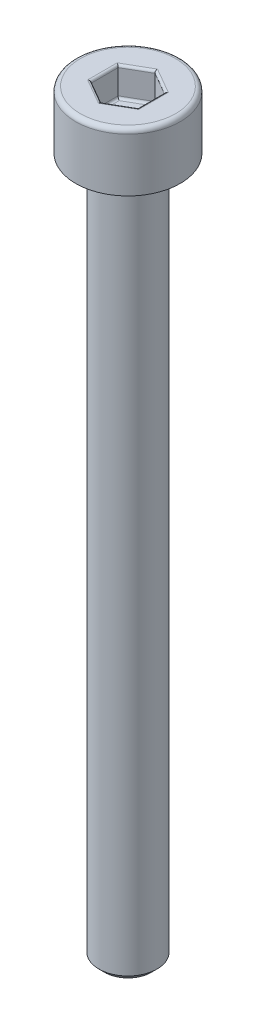
ISO-10303-21;
HEADER;
FILE_DESCRIPTION(('STEP AP214'),'2;1');
FILE_NAME('part.step','',(''),(''),'','','');
FILE_SCHEMA(('AUTOMOTIVE_DESIGN { 1 0 10303 214 1 1 1 1 }'));
ENDSEC;
DATA;
#1=APPLICATION_CONTEXT('core data for automotive mechanical design processes');
#2=APPLICATION_PROTOCOL_DEFINITION('international standard','automotive_design',2000,#1);
#3=PRODUCT_CONTEXT('',#1,'mechanical');
#4=PRODUCT('Part','Part','',(#3));
#5=PRODUCT_RELATED_PRODUCT_CATEGORY('part','',(#4));
#6=PRODUCT_DEFINITION_FORMATION('','',#4);
#7=PRODUCT_DEFINITION_CONTEXT('part definition',#1,'design');
#8=PRODUCT_DEFINITION('design','',#6,#7);
#9=PRODUCT_DEFINITION_SHAPE('','',#8);
#10=(LENGTH_UNIT() NAMED_UNIT(*) SI_UNIT(.MILLI.,.METRE.));
#11=(NAMED_UNIT(*) PLANE_ANGLE_UNIT() SI_UNIT($,.RADIAN.));
#12=(NAMED_UNIT(*) SI_UNIT($,.STERADIAN.) SOLID_ANGLE_UNIT());
#13=UNCERTAINTY_MEASURE_WITH_UNIT(LENGTH_MEASURE(1.E-05),#10,'distance_accuracy_value','');
#14=(GEOMETRIC_REPRESENTATION_CONTEXT(3) GLOBAL_UNCERTAINTY_ASSIGNED_CONTEXT((#13)) GLOBAL_UNIT_ASSIGNED_CONTEXT((#10,
#11,#12)) REPRESENTATION_CONTEXT('',''));
#15=CARTESIAN_POINT('',(0.,0.,0.));
#16=DIRECTION('',(0.,0.,1.));
#17=DIRECTION('',(1.,0.,0.));
#18=AXIS2_PLACEMENT_3D('',#15,#16,#17);
#19=CARTESIAN_POINT('',(0.,-32.5,0.));
#20=DIRECTION('',(0.,-1.,0.));
#21=DIRECTION('',(0.,0.,-1.));
#22=AXIS2_PLACEMENT_3D('',#19,#20,#21);
#23=PLANE('',#22);
#24=CARTESIAN_POINT('',(0.,-32.5,0.));
#25=DIRECTION('',(0.,-1.,0.));
#26=DIRECTION('',(0.,0.,-1.));
#27=AXIS2_PLACEMENT_3D('',#24,#25,#26);
#28=CIRCLE('',#27,0.999999999999997);
#29=CARTESIAN_POINT('',(0.,-32.5,-0.999999999999997));
#30=VERTEX_POINT('',#29);
#31=EDGE_CURVE('E261',#30,#30,#28,.T.);
#32=ORIENTED_EDGE('',*,*,#31,.T.);
#33=EDGE_LOOP('',(#32));
#34=FACE_BOUND('',#33,.T.);
#35=ADVANCED_FACE('F33',(#34),#23,.T.);
#36=CARTESIAN_POINT('',(0.,0.,0.));
#37=DIRECTION('',(0.,1.,0.));
#38=DIRECTION('',(0.,0.,1.));
#39=AXIS2_PLACEMENT_3D('',#36,#37,#38);
#40=CYLINDRICAL_SURFACE('',#39,1.25);
#41=CARTESIAN_POINT('',(0.,-2.74999999999999,0.));
#42=DIRECTION('',(0.,-1.,0.));
#43=DIRECTION('',(0.,0.,-1.));
#44=AXIS2_PLACEMENT_3D('',#41,#42,#43);
#45=CIRCLE('',#44,1.25);
#46=CARTESIAN_POINT('',(0.,-2.74999999999999,-1.25));
#47=VERTEX_POINT('',#46);
#48=EDGE_CURVE('E258',#47,#47,#45,.T.);
#49=ORIENTED_EDGE('',*,*,#48,.T.);
#50=EDGE_LOOP('',(#49));
#51=FACE_BOUND('',#50,.T.);
#52=CARTESIAN_POINT('',(0.,-32.25,0.));
#53=DIRECTION('',(0.,-1.,0.));
#54=DIRECTION('',(0.,0.,-1.));
#55=AXIS2_PLACEMENT_3D('',#52,#53,#54);
#56=CIRCLE('',#55,1.25);
#57=CARTESIAN_POINT('',(0.,-32.25,-1.25));
#58=VERTEX_POINT('',#57);
#59=EDGE_CURVE('E255',#58,#58,#56,.F.);
#60=ORIENTED_EDGE('',*,*,#59,.T.);
#61=EDGE_LOOP('',(#60));
#62=FACE_BOUND('',#61,.T.);
#63=ADVANCED_FACE('F287',(#51,#62),#40,.T.);
#64=CARTESIAN_POINT('',(-1.25,-2.5,0.));
#65=DIRECTION('',(0.,-1.,0.));
#66=DIRECTION('',(0.,0.,-1.));
#67=AXIS2_PLACEMENT_3D('',#64,#65,#66);
#68=PLANE('',#67);
#69=CARTESIAN_POINT('',(0.,-2.5,0.));
#70=DIRECTION('',(0.,-1.,0.));
#71=DIRECTION('',(0.,0.,-1.));
#72=AXIS2_PLACEMENT_3D('',#69,#70,#71);
#73=CIRCLE('',#72,1.49999999999999);
#74=CARTESIAN_POINT('',(0.,-2.5,-1.49999999999999));
#75=VERTEX_POINT('',#74);
#76=EDGE_CURVE('E252',#75,#75,#73,.F.);
#77=ORIENTED_EDGE('',*,*,#76,.T.);
#78=EDGE_LOOP('',(#77));
#79=FACE_BOUND('',#78,.T.);
#80=CARTESIAN_POINT('',(0.,-2.5,0.));
#81=DIRECTION('',(0.,1.,0.));
#82=DIRECTION('',(0.,0.,1.));
#83=AXIS2_PLACEMENT_3D('',#80,#81,#82);
#84=CIRCLE('',#83,2.25);
#85=CARTESIAN_POINT('',(0.,-2.5,2.25));
#86=VERTEX_POINT('',#85);
#87=EDGE_CURVE('E249',#86,#86,#84,.T.);
#88=ORIENTED_EDGE('',*,*,#87,.F.);
#89=EDGE_LOOP('',(#88));
#90=FACE_BOUND('',#89,.T.);
#91=ADVANCED_FACE('F293',(#79,#90),#68,.T.);
#92=CARTESIAN_POINT('',(0.,0.,0.));
#93=DIRECTION('',(0.,1.,0.));
#94=DIRECTION('',(0.,0.,1.));
#95=AXIS2_PLACEMENT_3D('',#92,#93,#94);
#96=CYLINDRICAL_SURFACE('',#95,2.25);
#97=CARTESIAN_POINT('',(0.,-0.2,0.));
#98=DIRECTION('',(0.,1.,0.));
#99=DIRECTION('',(0.,0.,1.));
#100=AXIS2_PLACEMENT_3D('',#97,#98,#99);
#101=CIRCLE('',#100,2.25);
#102=CARTESIAN_POINT('',(0.,-0.2,2.25));
#103=VERTEX_POINT('',#102);
#104=EDGE_CURVE('E159',#103,#103,#101,.F.);
#105=ORIENTED_EDGE('',*,*,#104,.T.);
#106=EDGE_LOOP('',(#105));
#107=FACE_BOUND('',#106,.T.);
#108=ORIENTED_EDGE('',*,*,#87,.T.);
#109=EDGE_LOOP('',(#108));
#110=FACE_BOUND('',#109,.T.);
#111=ADVANCED_FACE('F303',(#107,#110),#96,.T.);
#112=CARTESIAN_POINT('',(-2.25,0.,0.));
#113=DIRECTION('',(0.,1.,0.));
#114=DIRECTION('',(0.,0.,1.));
#115=AXIS2_PLACEMENT_3D('',#112,#113,#114);
#116=PLANE('',#115);
#117=DIRECTION('',(0.,0.,1.));
#118=VECTOR('',#117,1.);
#119=CARTESIAN_POINT('',(-1.1,0.,-0.577350269189627));
#120=LINE('',#119,#118);
#121=CARTESIAN_POINT('',(-1.1,0.,0.635085296108588));
#122=VERTEX_POINT('',#121);
#123=CARTESIAN_POINT('',(-1.1,0.,-0.635085296108589));
#124=VERTEX_POINT('',#123);
#125=EDGE_CURVE('E175',#122,#124,#120,.F.);
#126=ORIENTED_EDGE('',*,*,#125,.T.);
#127=DIRECTION('',(-0.866025403784439,0.,0.5));
#128=VECTOR('',#127,1.);
#129=CARTESIAN_POINT('',(-0.0500000000000009,0.,-1.2413030787577));
#130=LINE('',#129,#128);
#131=CARTESIAN_POINT('',(0.,0.,-1.27017059221718));
#132=VERTEX_POINT('',#131);
#133=EDGE_CURVE('E134',#124,#132,#130,.F.);
#134=ORIENTED_EDGE('',*,*,#133,.T.);
#135=DIRECTION('',(-0.866025403784439,0.,-0.5));
#136=VECTOR('',#135,1.);
#137=CARTESIAN_POINT('',(1.05,0.,-0.663952809568071));
#138=LINE('',#137,#136);
#139=CARTESIAN_POINT('',(1.1,0.,-0.63508529610859));
#140=VERTEX_POINT('',#139);
#141=EDGE_CURVE('E161',#132,#140,#138,.F.);
#142=ORIENTED_EDGE('',*,*,#141,.T.);
#143=DIRECTION('',(0.,0.,-1.));
#144=VECTOR('',#143,1.);
#145=CARTESIAN_POINT('',(1.1,0.,0.577350269189625));
#146=LINE('',#145,#144);
#147=CARTESIAN_POINT('',(1.1,0.,0.635085296108588));
#148=VERTEX_POINT('',#147);
#149=EDGE_CURVE('E169',#140,#148,#146,.F.);
#150=ORIENTED_EDGE('',*,*,#149,.T.);
#151=DIRECTION('',(0.866025403784439,0.,-0.5));
#152=VECTOR('',#151,1.);
#153=CARTESIAN_POINT('',(0.0499999999999991,0.,1.24130307875769));
#154=LINE('',#153,#152);
#155=CARTESIAN_POINT('',(0.,0.,1.27017059221718));
#156=VERTEX_POINT('',#155);
#157=EDGE_CURVE('E171',#148,#156,#154,.F.);
#158=ORIENTED_EDGE('',*,*,#157,.T.);
#159=DIRECTION('',(0.866025403784439,0.,0.5));
#160=VECTOR('',#159,1.);
#161=CARTESIAN_POINT('',(-1.05,0.,0.663952809568069));
#162=LINE('',#161,#160);
#163=EDGE_CURVE('E173',#156,#122,#162,.F.);
#164=ORIENTED_EDGE('',*,*,#163,.T.);
#165=EDGE_LOOP('',(#126,#134,#142,#150,#158,#164));
#166=FACE_BOUND('',#165,.T.);
#167=CARTESIAN_POINT('',(0.,0.,0.));
#168=DIRECTION('',(0.,1.,0.));
#169=DIRECTION('',(0.,0.,1.));
#170=AXIS2_PLACEMENT_3D('',#167,#168,#169);
#171=CIRCLE('',#170,2.05);
#172=CARTESIAN_POINT('',(0.,0.,2.05));
#173=VERTEX_POINT('',#172);
#174=EDGE_CURVE('E164',#173,#173,#171,.T.);
#175=ORIENTED_EDGE('',*,*,#174,.T.);
#176=EDGE_LOOP('',(#175));
#177=FACE_BOUND('',#176,.T.);
#178=ADVANCED_FACE('F266',(#166,#177),#116,.T.);
#179=CARTESIAN_POINT('',(0.,-2.5,0.));
#180=DIRECTION('',(0.,1.,0.));
#181=DIRECTION('',(0.,0.,1.));
#182=AXIS2_PLACEMENT_3D('',#179,#180,#181);
#183=CONICAL_SURFACE('',#182,1.49999999999999,0.78539816339745);
#184=ORIENTED_EDGE('',*,*,#48,.F.);
#185=EDGE_LOOP('',(#184));
#186=FACE_BOUND('',#185,.T.);
#187=ORIENTED_EDGE('',*,*,#76,.F.);
#188=EDGE_LOOP('',(#187));
#189=FACE_BOUND('',#188,.T.);
#190=ADVANCED_FACE('F281',(#186,#189),#183,.T.);
#191=CARTESIAN_POINT('',(0.,-32.25,0.));
#192=DIRECTION('',(0.,1.,0.));
#193=DIRECTION('',(0.,0.,1.));
#194=AXIS2_PLACEMENT_3D('',#191,#192,#193);
#195=CONICAL_SURFACE('',#194,1.25,0.785398163397446);
#196=ORIENTED_EDGE('',*,*,#31,.F.);
#197=EDGE_LOOP('',(#196));
#198=FACE_BOUND('',#197,.T.);
#199=ORIENTED_EDGE('',*,*,#59,.F.);
#200=EDGE_LOOP('',(#199));
#201=FACE_BOUND('',#200,.T.);
#202=ADVANCED_FACE('F271',(#198,#201),#195,.T.);
#203=CARTESIAN_POINT('',(0.,-0.2,0.));
#204=DIRECTION('',(0.,1.,0.));
#205=DIRECTION('',(0.,0.,1.));
#206=AXIS2_PLACEMENT_3D('',#203,#204,#205);
#207=TOROIDAL_SURFACE('',#206,2.05,0.2);
#208=ORIENTED_EDGE('',*,*,#104,.F.);
#209=EDGE_LOOP('',(#208));
#210=FACE_BOUND('',#209,.T.);
#211=ORIENTED_EDGE('',*,*,#174,.F.);
#212=EDGE_LOOP('',(#211));
#213=FACE_BOUND('',#212,.T.);
#214=ADVANCED_FACE('F268',(#210,#213),#207,.T.);
#215=CARTESIAN_POINT('',(0.999999999999998,-1.25,-0.577350269189627));
#216=DIRECTION('',(0.5,0.,-0.866025403784439));
#217=DIRECTION('',(-0.866025403784439,0.,-0.5));
#218=AXIS2_PLACEMENT_3D('',#215,#216,#217);
#219=PLANE('',#218);
#220=DIRECTION('',(0.,1.,0.));
#221=VECTOR('',#220,1.);
#222=CARTESIAN_POINT('',(0.999999999999998,-1.25,-0.577350269189627));
#223=LINE('',#222,#221);
#224=CARTESIAN_POINT('',(0.999999999999998,-1.15,-0.577350269189627));
#225=VERTEX_POINT('',#224);
#226=CARTESIAN_POINT('',(0.999999999999998,-0.1,-0.577350269189627));
#227=VERTEX_POINT('',#226);
#228=EDGE_CURVE('E243',#225,#227,#223,.T.);
#229=ORIENTED_EDGE('',*,*,#228,.T.);
#230=DIRECTION('',(-0.866025403784439,0.,-0.5));
#231=VECTOR('',#230,1.);
#232=CARTESIAN_POINT('',(0.,-0.1,-1.15470053837925));
#233=LINE('',#232,#231);
#234=CARTESIAN_POINT('',(0.,-0.1,-1.15470053837925));
#235=VERTEX_POINT('',#234);
#236=EDGE_CURVE('E195',#227,#235,#233,.T.);
#237=ORIENTED_EDGE('',*,*,#236,.T.);
#238=DIRECTION('',(0.,1.,0.));
#239=VECTOR('',#238,1.);
#240=CARTESIAN_POINT('',(0.,-1.25,-1.15470053837925));
#241=LINE('',#240,#239);
#242=CARTESIAN_POINT('',(0.,-1.15,-1.15470053837925));
#243=VERTEX_POINT('',#242);
#244=EDGE_CURVE('E145',#243,#235,#241,.T.);
#245=ORIENTED_EDGE('',*,*,#244,.F.);
#246=DIRECTION('',(-0.866025403784439,0.,-0.5));
#247=VECTOR('',#246,1.);
#248=CARTESIAN_POINT('',(0.999999999999998,-1.15,-0.577350269189627));
#249=LINE('',#248,#247);
#250=EDGE_CURVE('E193',#243,#225,#249,.F.);
#251=ORIENTED_EDGE('',*,*,#250,.T.);
#252=EDGE_LOOP('',(#229,#237,#245,#251));
#253=FACE_BOUND('',#252,.T.);
#254=ADVANCED_FACE('F270',(#253),#219,.F.);
#255=CARTESIAN_POINT('',(0.999999999999999,-1.25,0.577350269189625));
#256=DIRECTION('',(1.,0.,0.));
#257=DIRECTION('',(0.,0.,-1.));
#258=AXIS2_PLACEMENT_3D('',#255,#256,#257);
#259=PLANE('',#258);
#260=DIRECTION('',(0.,1.,0.));
#261=VECTOR('',#260,1.);
#262=CARTESIAN_POINT('',(0.999999999999999,-1.25,0.577350269189625));
#263=LINE('',#262,#261);
#264=CARTESIAN_POINT('',(0.999999999999999,-1.15,0.577350269189625));
#265=VERTEX_POINT('',#264);
#266=CARTESIAN_POINT('',(0.999999999999999,-0.1,0.577350269189625));
#267=VERTEX_POINT('',#266);
#268=EDGE_CURVE('E240',#265,#267,#263,.T.);
#269=ORIENTED_EDGE('',*,*,#268,.T.);
#270=DIRECTION('',(0.,0.,-1.));
#271=VECTOR('',#270,1.);
#272=CARTESIAN_POINT('',(0.999999999999998,-0.1,-0.577350269189627));
#273=LINE('',#272,#271);
#274=EDGE_CURVE('E191',#267,#227,#273,.T.);
#275=ORIENTED_EDGE('',*,*,#274,.T.);
#276=ORIENTED_EDGE('',*,*,#228,.F.);
#277=DIRECTION('',(0.,0.,-1.));
#278=VECTOR('',#277,1.);
#279=CARTESIAN_POINT('',(0.999999999999999,-1.15,0.577350269189625));
#280=LINE('',#279,#278);
#281=EDGE_CURVE('E188',#225,#265,#280,.F.);
#282=ORIENTED_EDGE('',*,*,#281,.T.);
#283=EDGE_LOOP('',(#269,#275,#276,#282));
#284=FACE_BOUND('',#283,.T.);
#285=ADVANCED_FACE('F278',(#284),#259,.F.);
#286=CARTESIAN_POINT('',(0.,-1.25,1.15470053837925));
#287=DIRECTION('',(0.5,0.,0.866025403784439));
#288=DIRECTION('',(0.866025403784439,0.,-0.5));
#289=AXIS2_PLACEMENT_3D('',#286,#287,#288);
#290=PLANE('',#289);
#291=DIRECTION('',(0.,1.,0.));
#292=VECTOR('',#291,1.);
#293=CARTESIAN_POINT('',(0.,-1.25,1.15470053837925));
#294=LINE('',#293,#292);
#295=CARTESIAN_POINT('',(0.,-1.15,1.15470053837925));
#296=VERTEX_POINT('',#295);
#297=CARTESIAN_POINT('',(0.,-0.1,1.15470053837925));
#298=VERTEX_POINT('',#297);
#299=EDGE_CURVE('E237',#296,#298,#294,.T.);
#300=ORIENTED_EDGE('',*,*,#299,.T.);
#301=DIRECTION('',(0.866025403784439,0.,-0.5));
#302=VECTOR('',#301,1.);
#303=CARTESIAN_POINT('',(0.999999999999999,-0.1,0.577350269189625));
#304=LINE('',#303,#302);
#305=EDGE_CURVE('E186',#298,#267,#304,.T.);
#306=ORIENTED_EDGE('',*,*,#305,.T.);
#307=ORIENTED_EDGE('',*,*,#268,.F.);
#308=DIRECTION('',(0.866025403784439,0.,-0.5));
#309=VECTOR('',#308,1.);
#310=CARTESIAN_POINT('',(0.,-1.15,1.15470053837925));
#311=LINE('',#310,#309);
#312=EDGE_CURVE('E184',#265,#296,#311,.F.);
#313=ORIENTED_EDGE('',*,*,#312,.T.);
#314=EDGE_LOOP('',(#300,#306,#307,#313));
#315=FACE_BOUND('',#314,.T.);
#316=ADVANCED_FACE('F327',(#315),#290,.F.);
#317=CARTESIAN_POINT('',(-1.,-1.25,0.577350269189625));
#318=DIRECTION('',(-0.5,0.,0.866025403784438));
#319=DIRECTION('',(0.866025403784439,0.,0.5));
#320=AXIS2_PLACEMENT_3D('',#317,#318,#319);
#321=PLANE('',#320);
#322=DIRECTION('',(0.,1.,0.));
#323=VECTOR('',#322,1.);
#324=CARTESIAN_POINT('',(-1.,-1.25,0.577350269189625));
#325=LINE('',#324,#323);
#326=CARTESIAN_POINT('',(-1.,-1.15,0.577350269189625));
#327=VERTEX_POINT('',#326);
#328=CARTESIAN_POINT('',(-1.,-0.1,0.577350269189625));
#329=VERTEX_POINT('',#328);
#330=EDGE_CURVE('E128',#327,#329,#325,.T.);
#331=ORIENTED_EDGE('',*,*,#330,.T.);
#332=DIRECTION('',(0.866025403784439,0.,0.5));
#333=VECTOR('',#332,1.);
#334=CARTESIAN_POINT('',(0.,-0.1,1.15470053837925));
#335=LINE('',#334,#333);
#336=EDGE_CURVE('E182',#329,#298,#335,.T.);
#337=ORIENTED_EDGE('',*,*,#336,.T.);
#338=ORIENTED_EDGE('',*,*,#299,.F.);
#339=DIRECTION('',(0.866025403784439,0.,0.5));
#340=VECTOR('',#339,1.);
#341=CARTESIAN_POINT('',(-1.,-1.15,0.577350269189625));
#342=LINE('',#341,#340);
#343=EDGE_CURVE('E180',#296,#327,#342,.F.);
#344=ORIENTED_EDGE('',*,*,#343,.T.);
#345=EDGE_LOOP('',(#331,#337,#338,#344));
#346=FACE_BOUND('',#345,.T.);
#347=ADVANCED_FACE('F234',(#346),#321,.F.);
#348=CARTESIAN_POINT('',(-1.,-1.25,-0.577350269189627));
#349=DIRECTION('',(-1.,0.,0.));
#350=DIRECTION('',(0.,0.,1.));
#351=AXIS2_PLACEMENT_3D('',#348,#349,#350);
#352=PLANE('',#351);
#353=DIRECTION('',(0.,1.,0.));
#354=VECTOR('',#353,1.);
#355=CARTESIAN_POINT('',(-1.,-1.25,-0.577350269189627));
#356=LINE('',#355,#354);
#357=CARTESIAN_POINT('',(-1.,-1.15,-0.577350269189627));
#358=VERTEX_POINT('',#357);
#359=CARTESIAN_POINT('',(-1.,-0.1,-0.577350269189627));
#360=VERTEX_POINT('',#359);
#361=EDGE_CURVE('E126',#358,#360,#356,.T.);
#362=ORIENTED_EDGE('',*,*,#361,.T.);
#363=DIRECTION('',(0.,0.,1.));
#364=VECTOR('',#363,1.);
#365=CARTESIAN_POINT('',(-1.,-0.1,0.577350269189625));
#366=LINE('',#365,#364);
#367=EDGE_CURVE('E133',#360,#329,#366,.T.);
#368=ORIENTED_EDGE('',*,*,#367,.T.);
#369=ORIENTED_EDGE('',*,*,#330,.F.);
#370=DIRECTION('',(0.,0.,1.));
#371=VECTOR('',#370,1.);
#372=CARTESIAN_POINT('',(-1.,-1.15,-0.577350269189627));
#373=LINE('',#372,#371);
#374=EDGE_CURVE('E123',#327,#358,#373,.F.);
#375=ORIENTED_EDGE('',*,*,#374,.T.);
#376=EDGE_LOOP('',(#362,#368,#369,#375));
#377=FACE_BOUND('',#376,.T.);
#378=ADVANCED_FACE('F125',(#377),#352,.F.);
#379=CARTESIAN_POINT('',(0.,-1.25,-1.15470053837925));
#380=DIRECTION('',(-0.5,0.,-0.866025403784438));
#381=DIRECTION('',(-0.866025403784439,0.,0.5));
#382=AXIS2_PLACEMENT_3D('',#379,#380,#381);
#383=PLANE('',#382);
#384=ORIENTED_EDGE('',*,*,#244,.T.);
#385=DIRECTION('',(-0.866025403784439,0.,0.5));
#386=VECTOR('',#385,1.);
#387=CARTESIAN_POINT('',(-1.,-0.1,-0.577350269189626));
#388=LINE('',#387,#386);
#389=EDGE_CURVE('E144',#235,#360,#388,.T.);
#390=ORIENTED_EDGE('',*,*,#389,.T.);
#391=ORIENTED_EDGE('',*,*,#361,.F.);
#392=DIRECTION('',(-0.866025403784439,0.,0.5));
#393=VECTOR('',#392,1.);
#394=CARTESIAN_POINT('',(0.,-1.15,-1.15470053837925));
#395=LINE('',#394,#393);
#396=EDGE_CURVE('E141',#358,#243,#395,.F.);
#397=ORIENTED_EDGE('',*,*,#396,.T.);
#398=EDGE_LOOP('',(#384,#390,#391,#397));
#399=FACE_BOUND('',#398,.T.);
#400=ADVANCED_FACE('F139',(#399),#383,.F.);
#401=CARTESIAN_POINT('',(0.,-1.25,-1.15470053837925));
#402=DIRECTION('',(0.,1.,0.));
#403=DIRECTION('',(0.,0.,1.));
#404=AXIS2_PLACEMENT_3D('',#401,#402,#403);
#405=PLANE('',#404);
#406=DIRECTION('',(0.866025403784439,0.,-0.5));
#407=VECTOR('',#406,1.);
#408=CARTESIAN_POINT('',(0.949999999999999,-1.25,0.490747728811181));
#409=LINE('',#408,#407);
#410=CARTESIAN_POINT('',(0.,-1.25,1.03923048454133));
#411=VERTEX_POINT('',#410);
#412=CARTESIAN_POINT('',(0.899999999999999,-1.25,0.519615242270663));
#413=VERTEX_POINT('',#412);
#414=EDGE_CURVE('E42',#411,#413,#409,.T.);
#415=ORIENTED_EDGE('',*,*,#414,.T.);
#416=DIRECTION('',(0.,0.,-1.));
#417=VECTOR('',#416,1.);
#418=CARTESIAN_POINT('',(0.899999999999998,-1.25,-1.15470053837925));
#419=LINE('',#418,#417);
#420=CARTESIAN_POINT('',(0.899999999999998,-1.25,-0.519615242270664));
#421=VERTEX_POINT('',#420);
#422=EDGE_CURVE('E11',#413,#421,#419,.T.);
#423=ORIENTED_EDGE('',*,*,#422,.T.);
#424=DIRECTION('',(-0.866025403784439,0.,-0.5));
#425=VECTOR('',#424,1.);
#426=CARTESIAN_POINT('',(-0.0500000000000008,-1.25,-1.06809799800081));
#427=LINE('',#426,#425);
#428=CARTESIAN_POINT('',(0.,-1.25,-1.03923048454133));
#429=VERTEX_POINT('',#428);
#430=EDGE_CURVE('E197',#421,#429,#427,.T.);
#431=ORIENTED_EDGE('',*,*,#430,.T.);
#432=DIRECTION('',(-0.866025403784439,0.,0.5));
#433=VECTOR('',#432,1.);
#434=CARTESIAN_POINT('',(0.0499999999999993,-1.25,-1.06809799800081));
#435=LINE('',#434,#433);
#436=CARTESIAN_POINT('',(-0.9,-1.25,-0.519615242270664));
#437=VERTEX_POINT('',#436);
#438=EDGE_CURVE('E199',#429,#437,#435,.T.);
#439=ORIENTED_EDGE('',*,*,#438,.T.);
#440=DIRECTION('',(0.,0.,1.));
#441=VECTOR('',#440,1.);
#442=CARTESIAN_POINT('',(-0.9,-1.25,-1.15470053837925));
#443=LINE('',#442,#441);
#444=CARTESIAN_POINT('',(-0.9,-1.25,0.519615242270662));
#445=VERTEX_POINT('',#444);
#446=EDGE_CURVE('E150',#437,#445,#443,.T.);
#447=ORIENTED_EDGE('',*,*,#446,.T.);
#448=DIRECTION('',(0.866025403784439,0.,0.5));
#449=VECTOR('',#448,1.);
#450=CARTESIAN_POINT('',(-0.950000000000001,-1.25,0.490747728811181));
#451=LINE('',#450,#449);
#452=EDGE_CURVE('E53',#445,#411,#451,.T.);
#453=ORIENTED_EDGE('',*,*,#452,.T.);
#454=EDGE_LOOP('',(#415,#423,#431,#439,#447,#453));
#455=FACE_BOUND('',#454,.T.);
#456=ADVANCED_FACE('F322',(#455),#405,.T.);
#457=CARTESIAN_POINT('',(0.0499999999999991,-0.1,1.24130307875769));
#458=DIRECTION('',(-0.866025403784439,0.,0.5));
#459=DIRECTION('',(0.5,0.,0.866025403784439));
#460=AXIS2_PLACEMENT_3D('',#457,#458,#459);
#461=CYLINDRICAL_SURFACE('',#460,0.1);
#462=CARTESIAN_POINT('',(0.,-0.1,1.27017059221718));
#463=DIRECTION('',(-1.,0.,0.));
#464=DIRECTION('',(0.,0.,-1.));
#465=AXIS2_PLACEMENT_3D('',#462,#463,#464);
#466=ELLIPSE('',#465,0.115470053837925,0.1);
#467=EDGE_CURVE('E214',#156,#298,#466,.T.);
#468=ORIENTED_EDGE('',*,*,#467,.F.);
#469=ORIENTED_EDGE('',*,*,#157,.F.);
#470=CARTESIAN_POINT('',(1.1,-0.1,0.635085296108588));
#471=DIRECTION('',(-0.5,0.,0.866025403784439));
#472=DIRECTION('',(-0.866025403784439,0.,-0.5));
#473=AXIS2_PLACEMENT_3D('',#470,#471,#472);
#474=ELLIPSE('',#473,0.115470053837925,0.1);
#475=EDGE_CURVE('E217',#267,#148,#474,.F.);
#476=ORIENTED_EDGE('',*,*,#475,.F.);
#477=ORIENTED_EDGE('',*,*,#305,.F.);
#478=EDGE_LOOP('',(#468,#469,#476,#477));
#479=FACE_BOUND('',#478,.T.);
#480=ADVANCED_FACE('F334',(#479),#461,.T.);
#481=CARTESIAN_POINT('',(1.1,-0.1,0.577350269189625));
#482=DIRECTION('',(0.,0.,1.));
#483=DIRECTION('',(1.,0.,0.));
#484=AXIS2_PLACEMENT_3D('',#481,#482,#483);
#485=CYLINDRICAL_SURFACE('',#484,0.1);
#486=ORIENTED_EDGE('',*,*,#475,.T.);
#487=ORIENTED_EDGE('',*,*,#149,.F.);
#488=CARTESIAN_POINT('',(1.1,-0.1,-0.63508529610859));
#489=DIRECTION('',(0.5,0.,0.866025403784439));
#490=DIRECTION('',(-0.866025403784439,0.,0.5));
#491=AXIS2_PLACEMENT_3D('',#488,#489,#490);
#492=ELLIPSE('',#491,0.115470053837925,0.1);
#493=EDGE_CURVE('E211',#227,#140,#492,.F.);
#494=ORIENTED_EDGE('',*,*,#493,.F.);
#495=ORIENTED_EDGE('',*,*,#274,.F.);
#496=EDGE_LOOP('',(#486,#487,#494,#495));
#497=FACE_BOUND('',#496,.T.);
#498=ADVANCED_FACE('F338',(#497),#485,.T.);
#499=CARTESIAN_POINT('',(-1.05,-0.1,0.663952809568069));
#500=DIRECTION('',(-0.866025403784439,0.,-0.5));
#501=DIRECTION('',(-0.5,0.,0.866025403784438));
#502=AXIS2_PLACEMENT_3D('',#499,#500,#501);
#503=CYLINDRICAL_SURFACE('',#502,0.1);
#504=ORIENTED_EDGE('',*,*,#467,.T.);
#505=ORIENTED_EDGE('',*,*,#336,.F.);
#506=CARTESIAN_POINT('',(-1.1,-0.1,0.635085296108587));
#507=DIRECTION('',(-0.5,0.,-0.866025403784439));
#508=DIRECTION('',(0.866025403784439,0.,-0.5));
#509=AXIS2_PLACEMENT_3D('',#506,#507,#508);
#510=ELLIPSE('',#509,0.115470053837925,0.1);
#511=EDGE_CURVE('E208',#122,#329,#510,.T.);
#512=ORIENTED_EDGE('',*,*,#511,.F.);
#513=ORIENTED_EDGE('',*,*,#163,.F.);
#514=EDGE_LOOP('',(#504,#505,#512,#513));
#515=FACE_BOUND('',#514,.T.);
#516=ADVANCED_FACE('F344',(#515),#503,.T.);
#517=CARTESIAN_POINT('',(1.05,-0.1,-0.663952809568071));
#518=DIRECTION('',(0.866025403784439,0.,0.5));
#519=DIRECTION('',(0.5,0.,-0.866025403784439));
#520=AXIS2_PLACEMENT_3D('',#517,#518,#519);
#521=CYLINDRICAL_SURFACE('',#520,0.1);
#522=ORIENTED_EDGE('',*,*,#493,.T.);
#523=ORIENTED_EDGE('',*,*,#141,.F.);
#524=CARTESIAN_POINT('',(0.,-0.1,-1.27017059221718));
#525=DIRECTION('',(1.,0.,0.));
#526=DIRECTION('',(0.,0.,-1.));
#527=AXIS2_PLACEMENT_3D('',#524,#525,#526);
#528=ELLIPSE('',#527,0.115470053837925,0.1);
#529=EDGE_CURVE('E206',#235,#132,#528,.F.);
#530=ORIENTED_EDGE('',*,*,#529,.F.);
#531=ORIENTED_EDGE('',*,*,#236,.F.);
#532=EDGE_LOOP('',(#522,#523,#530,#531));
#533=FACE_BOUND('',#532,.T.);
#534=ADVANCED_FACE('F374',(#533),#521,.T.);
#535=CARTESIAN_POINT('',(-1.1,-0.1,-0.577350269189627));
#536=DIRECTION('',(0.,0.,-1.));
#537=DIRECTION('',(-1.,0.,0.));
#538=AXIS2_PLACEMENT_3D('',#535,#536,#537);
#539=CYLINDRICAL_SURFACE('',#538,0.1);
#540=ORIENTED_EDGE('',*,*,#511,.T.);
#541=ORIENTED_EDGE('',*,*,#367,.F.);
#542=CARTESIAN_POINT('',(-1.1,-0.1,-0.635085296108589));
#543=DIRECTION('',(0.5,0.,-0.866025403784439));
#544=DIRECTION('',(0.866025403784439,0.,0.5));
#545=AXIS2_PLACEMENT_3D('',#542,#543,#544);
#546=ELLIPSE('',#545,0.115470053837925,0.1);
#547=EDGE_CURVE('E204',#124,#360,#546,.T.);
#548=ORIENTED_EDGE('',*,*,#547,.F.);
#549=ORIENTED_EDGE('',*,*,#125,.F.);
#550=EDGE_LOOP('',(#540,#541,#548,#549));
#551=FACE_BOUND('',#550,.T.);
#552=ADVANCED_FACE('F369',(#551),#539,.T.);
#553=CARTESIAN_POINT('',(-0.0500000000000009,-0.1,-1.2413030787577));
#554=DIRECTION('',(0.866025403784439,0.,-0.5));
#555=DIRECTION('',(-0.5,0.,-0.866025403784438));
#556=AXIS2_PLACEMENT_3D('',#553,#554,#555);
#557=CYLINDRICAL_SURFACE('',#556,0.1);
#558=ORIENTED_EDGE('',*,*,#529,.T.);
#559=ORIENTED_EDGE('',*,*,#133,.F.);
#560=ORIENTED_EDGE('',*,*,#547,.T.);
#561=ORIENTED_EDGE('',*,*,#389,.F.);
#562=EDGE_LOOP('',(#558,#559,#560,#561));
#563=FACE_BOUND('',#562,.T.);
#564=ADVANCED_FACE('F365',(#563),#557,.T.);
#565=CARTESIAN_POINT('',(-0.9,-1.15,-1.15470053837925));
#566=DIRECTION('',(0.,0.,1.));
#567=DIRECTION('',(1.,0.,0.));
#568=AXIS2_PLACEMENT_3D('',#565,#566,#567);
#569=CYLINDRICAL_SURFACE('',#568,0.1);
#570=CARTESIAN_POINT('',(-0.900000000000001,-1.15,-0.519615242270664));
#571=DIRECTION('',(-0.5,0.,0.866025403784439));
#572=DIRECTION('',(0.866025403784439,0.,0.5));
#573=AXIS2_PLACEMENT_3D('',#570,#571,#572);
#574=ELLIPSE('',#573,0.115470053837925,0.1);
#575=EDGE_CURVE('E149',#358,#437,#574,.T.);
#576=ORIENTED_EDGE('',*,*,#575,.F.);
#577=ORIENTED_EDGE('',*,*,#374,.F.);
#578=CARTESIAN_POINT('',(-0.9,-1.15,0.519615242270662));
#579=DIRECTION('',(0.5,0.,0.866025403784439));
#580=DIRECTION('',(0.866025403784439,0.,-0.5));
#581=AXIS2_PLACEMENT_3D('',#578,#579,#580);
#582=ELLIPSE('',#581,0.115470053837925,0.1);
#583=EDGE_CURVE('E37',#445,#327,#582,.F.);
#584=ORIENTED_EDGE('',*,*,#583,.F.);
#585=ORIENTED_EDGE('',*,*,#446,.F.);
#586=EDGE_LOOP('',(#576,#577,#584,#585));
#587=FACE_BOUND('',#586,.T.);
#588=ADVANCED_FACE('F35',(#587),#569,.F.);
#589=CARTESIAN_POINT('',(-0.950000000000001,-1.15,0.490747728811181));
#590=DIRECTION('',(0.866025403784439,0.,0.5));
#591=DIRECTION('',(0.5,0.,-0.866025403784438));
#592=AXIS2_PLACEMENT_3D('',#589,#590,#591);
#593=CYLINDRICAL_SURFACE('',#592,0.1);
#594=ORIENTED_EDGE('',*,*,#583,.T.);
#595=ORIENTED_EDGE('',*,*,#343,.F.);
#596=CARTESIAN_POINT('',(0.,-1.15,1.03923048454133));
#597=DIRECTION('',(1.,0.,0.));
#598=DIRECTION('',(0.,0.,-1.));
#599=AXIS2_PLACEMENT_3D('',#596,#597,#598);
#600=ELLIPSE('',#599,0.115470053837925,0.1);
#601=EDGE_CURVE('E153',#411,#296,#600,.F.);
#602=ORIENTED_EDGE('',*,*,#601,.F.);
#603=ORIENTED_EDGE('',*,*,#452,.F.);
#604=EDGE_LOOP('',(#594,#595,#602,#603));
#605=FACE_BOUND('',#604,.T.);
#606=ADVANCED_FACE('F231',(#605),#593,.F.);
#607=CARTESIAN_POINT('',(0.0499999999999993,-1.15,-1.06809799800081));
#608=DIRECTION('',(-0.866025403784439,0.,0.5));
#609=DIRECTION('',(0.5,0.,0.866025403784438));
#610=AXIS2_PLACEMENT_3D('',#607,#608,#609);
#611=CYLINDRICAL_SURFACE('',#610,0.1);
#612=ORIENTED_EDGE('',*,*,#575,.T.);
#613=ORIENTED_EDGE('',*,*,#438,.F.);
#614=CARTESIAN_POINT('',(0.,-1.15,-1.03923048454133));
#615=DIRECTION('',(-1.,0.,0.));
#616=DIRECTION('',(0.,0.,1.));
#617=AXIS2_PLACEMENT_3D('',#614,#615,#616);
#618=ELLIPSE('',#617,0.115470053837925,0.1);
#619=EDGE_CURVE('E157',#243,#429,#618,.T.);
#620=ORIENTED_EDGE('',*,*,#619,.F.);
#621=ORIENTED_EDGE('',*,*,#396,.F.);
#622=EDGE_LOOP('',(#612,#613,#620,#621));
#623=FACE_BOUND('',#622,.T.);
#624=ADVANCED_FACE('F155',(#623),#611,.F.);
#625=CARTESIAN_POINT('',(0.949999999999999,-1.15,0.490747728811181));
#626=DIRECTION('',(0.866025403784439,0.,-0.5));
#627=DIRECTION('',(-0.5,0.,-0.866025403784439));
#628=AXIS2_PLACEMENT_3D('',#625,#626,#627);
#629=CYLINDRICAL_SURFACE('',#628,0.1);
#630=ORIENTED_EDGE('',*,*,#601,.T.);
#631=ORIENTED_EDGE('',*,*,#312,.F.);
#632=CARTESIAN_POINT('',(0.899999999999999,-1.15,0.519615242270662));
#633=DIRECTION('',(0.5,0.,-0.866025403784439));
#634=DIRECTION('',(-0.866025403784439,0.,-0.5));
#635=AXIS2_PLACEMENT_3D('',#632,#633,#634);
#636=ELLIPSE('',#635,0.115470053837925,0.1);
#637=EDGE_CURVE('E222',#413,#265,#636,.F.);
#638=ORIENTED_EDGE('',*,*,#637,.F.);
#639=ORIENTED_EDGE('',*,*,#414,.F.);
#640=EDGE_LOOP('',(#630,#631,#638,#639));
#641=FACE_BOUND('',#640,.T.);
#642=ADVANCED_FACE('F228',(#641),#629,.F.);
#643=CARTESIAN_POINT('',(-0.0500000000000008,-1.15,-1.06809799800081));
#644=DIRECTION('',(-0.866025403784439,0.,-0.5));
#645=DIRECTION('',(-0.5,0.,0.866025403784439));
#646=AXIS2_PLACEMENT_3D('',#643,#644,#645);
#647=CYLINDRICAL_SURFACE('',#646,0.1);
#648=ORIENTED_EDGE('',*,*,#619,.T.);
#649=ORIENTED_EDGE('',*,*,#430,.F.);
#650=CARTESIAN_POINT('',(0.899999999999998,-1.15,-0.519615242270664));
#651=DIRECTION('',(-0.5,0.,-0.866025403784439));
#652=DIRECTION('',(0.866025403784439,0.,-0.5));
#653=AXIS2_PLACEMENT_3D('',#650,#651,#652);
#654=ELLIPSE('',#653,0.115470053837925,0.1);
#655=EDGE_CURVE('E220',#225,#421,#654,.T.);
#656=ORIENTED_EDGE('',*,*,#655,.F.);
#657=ORIENTED_EDGE('',*,*,#250,.F.);
#658=EDGE_LOOP('',(#648,#649,#656,#657));
#659=FACE_BOUND('',#658,.T.);
#660=ADVANCED_FACE('F353',(#659),#647,.F.);
#661=CARTESIAN_POINT('',(0.899999999999998,-1.15,-1.15470053837925));
#662=DIRECTION('',(0.,0.,-1.));
#663=DIRECTION('',(-1.,0.,0.));
#664=AXIS2_PLACEMENT_3D('',#661,#662,#663);
#665=CYLINDRICAL_SURFACE('',#664,0.1);
#666=ORIENTED_EDGE('',*,*,#637,.T.);
#667=ORIENTED_EDGE('',*,*,#281,.F.);
#668=ORIENTED_EDGE('',*,*,#655,.T.);
#669=ORIENTED_EDGE('',*,*,#422,.F.);
#670=EDGE_LOOP('',(#666,#667,#668,#669));
#671=FACE_BOUND('',#670,.T.);
#672=ADVANCED_FACE('F350',(#671),#665,.F.);
#673=CLOSED_SHELL('',(#35,#63,#91,#111,#178,#190,#202,#214,#254,#285,#316,#347,#378,#400,#456,
#480,#498,#516,#534,#552,#564,#588,#606,#624,#642,#660,#672));
#674=MANIFOLD_SOLID_BREP('B2',#673);
#675=ADVANCED_BREP_SHAPE_REPRESENTATION('',(#18,#674),#14);
#676=SHAPE_DEFINITION_REPRESENTATION(#9,#675);
ENDSEC;
END-ISO-10303-21;
